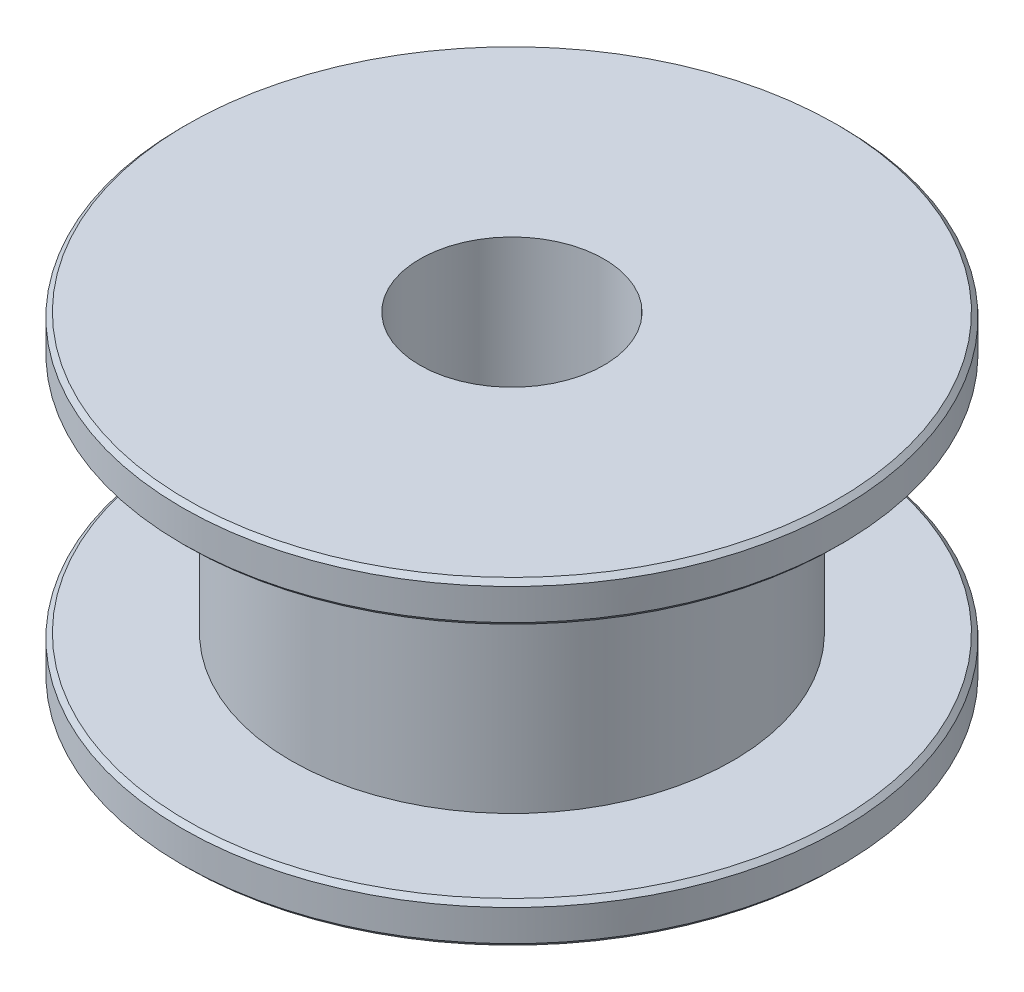
ISO-10303-21;
HEADER;
FILE_DESCRIPTION(('STEP AP214'),'2;1');
FILE_NAME('part.step','',(''),(''),'','','');
FILE_SCHEMA(('AUTOMOTIVE_DESIGN { 1 0 10303 214 1 1 1 1 }'));
ENDSEC;
DATA;
#1=APPLICATION_CONTEXT('core data for automotive mechanical design processes');
#2=APPLICATION_PROTOCOL_DEFINITION('international standard','automotive_design',2000,#1);
#3=PRODUCT_CONTEXT('',#1,'mechanical');
#4=PRODUCT('Part','Part','',(#3));
#5=PRODUCT_RELATED_PRODUCT_CATEGORY('part','',(#4));
#6=PRODUCT_DEFINITION_FORMATION('','',#4);
#7=PRODUCT_DEFINITION_CONTEXT('part definition',#1,'design');
#8=PRODUCT_DEFINITION('design','',#6,#7);
#9=PRODUCT_DEFINITION_SHAPE('','',#8);
#10=(LENGTH_UNIT() NAMED_UNIT(*) SI_UNIT(.MILLI.,.METRE.));
#11=(NAMED_UNIT(*) PLANE_ANGLE_UNIT() SI_UNIT($,.RADIAN.));
#12=(NAMED_UNIT(*) SI_UNIT($,.STERADIAN.) SOLID_ANGLE_UNIT());
#13=UNCERTAINTY_MEASURE_WITH_UNIT(LENGTH_MEASURE(1.E-05),#10,'distance_accuracy_value','');
#14=(GEOMETRIC_REPRESENTATION_CONTEXT(3) GLOBAL_UNCERTAINTY_ASSIGNED_CONTEXT((#13)) GLOBAL_UNIT_ASSIGNED_CONTEXT((#10,
#11,#12)) REPRESENTATION_CONTEXT('',''));
#15=CARTESIAN_POINT('',(0.,0.,0.));
#16=DIRECTION('',(0.,0.,1.));
#17=DIRECTION('',(1.,0.,0.));
#18=AXIS2_PLACEMENT_3D('',#15,#16,#17);
#19=CARTESIAN_POINT('',(8.95,4.325,0.));
#20=DIRECTION('',(0.,-1.,0.));
#21=DIRECTION('',(0.,0.,-1.));
#22=AXIS2_PLACEMENT_3D('',#19,#20,#21);
#23=PLANE('',#22);
#24=CARTESIAN_POINT('',(0.,4.325,0.));
#25=DIRECTION('',(0.,-1.,0.));
#26=DIRECTION('',(0.,0.,-1.));
#27=AXIS2_PLACEMENT_3D('',#24,#25,#26);
#28=CIRCLE('',#27,8.82499999999999);
#29=CARTESIAN_POINT('',(0.,4.325,-8.82499999999999));
#30=VERTEX_POINT('',#29);
#31=EDGE_CURVE('E10',#30,#30,#28,.F.);
#32=ORIENTED_EDGE('',*,*,#31,.T.);
#33=EDGE_LOOP('',(#32));
#34=FACE_BOUND('',#33,.T.);
#35=CARTESIAN_POINT('',(0.,4.325,0.));
#36=DIRECTION('',(0.,1.,0.));
#37=DIRECTION('',(0.,0.,1.));
#38=AXIS2_PLACEMENT_3D('',#35,#36,#37);
#39=CIRCLE('',#38,2.5);
#40=CARTESIAN_POINT('',(0.,4.325,2.5));
#41=VERTEX_POINT('',#40);
#42=EDGE_CURVE('E63',#41,#41,#39,.T.);
#43=ORIENTED_EDGE('',*,*,#42,.F.);
#44=EDGE_LOOP('',(#43));
#45=FACE_BOUND('',#44,.T.);
#46=ADVANCED_FACE('F31',(#34,#45),#23,.F.);
#47=CARTESIAN_POINT('',(0.,55.,0.));
#48=DIRECTION('',(0.,1.,0.));
#49=DIRECTION('',(0.,0.,1.));
#50=AXIS2_PLACEMENT_3D('',#47,#48,#49);
#51=CYLINDRICAL_SURFACE('',#50,2.5);
#52=CARTESIAN_POINT('',(0.,-4.325,0.));
#53=DIRECTION('',(0.,1.,0.));
#54=DIRECTION('',(0.,0.,1.));
#55=AXIS2_PLACEMENT_3D('',#52,#53,#54);
#56=CIRCLE('',#55,2.5);
#57=CARTESIAN_POINT('',(0.,-4.325,2.5));
#58=VERTEX_POINT('',#57);
#59=EDGE_CURVE('E66',#58,#58,#56,.T.);
#60=ORIENTED_EDGE('',*,*,#59,.F.);
#61=EDGE_LOOP('',(#60));
#62=FACE_BOUND('',#61,.T.);
#63=ORIENTED_EDGE('',*,*,#42,.T.);
#64=EDGE_LOOP('',(#63));
#65=FACE_BOUND('',#64,.T.);
#66=ADVANCED_FACE('F96',(#62,#65),#51,.F.);
#67=CARTESIAN_POINT('',(2.5,-4.325,0.));
#68=DIRECTION('',(0.,1.,0.));
#69=DIRECTION('',(0.,0.,1.));
#70=AXIS2_PLACEMENT_3D('',#67,#68,#69);
#71=PLANE('',#70);
#72=CARTESIAN_POINT('',(0.,-4.325,0.));
#73=DIRECTION('',(0.,1.,0.));
#74=DIRECTION('',(0.,0.,1.));
#75=AXIS2_PLACEMENT_3D('',#72,#73,#74);
#76=CIRCLE('',#75,8.825);
#77=CARTESIAN_POINT('',(0.,-4.325,8.825));
#78=VERTEX_POINT('',#77);
#79=EDGE_CURVE('E54',#78,#78,#76,.F.);
#80=ORIENTED_EDGE('',*,*,#79,.T.);
#81=EDGE_LOOP('',(#80));
#82=FACE_BOUND('',#81,.T.);
#83=ORIENTED_EDGE('',*,*,#59,.T.);
#84=EDGE_LOOP('',(#83));
#85=FACE_BOUND('',#84,.T.);
#86=ADVANCED_FACE('F92',(#82,#85),#71,.F.);
#87=CARTESIAN_POINT('',(0.,55.,0.));
#88=DIRECTION('',(0.,1.,0.));
#89=DIRECTION('',(0.,0.,1.));
#90=AXIS2_PLACEMENT_3D('',#87,#88,#89);
#91=CYLINDRICAL_SURFACE('',#90,8.95);
#92=CARTESIAN_POINT('',(0.,-4.20000000000001,0.));
#93=DIRECTION('',(0.,1.,0.));
#94=DIRECTION('',(0.,0.,1.));
#95=AXIS2_PLACEMENT_3D('',#92,#93,#94);
#96=CIRCLE('',#95,8.95);
#97=CARTESIAN_POINT('',(0.,-4.20000000000001,8.95));
#98=VERTEX_POINT('',#97);
#99=EDGE_CURVE('E57',#98,#98,#96,.T.);
#100=ORIENTED_EDGE('',*,*,#99,.T.);
#101=EDGE_LOOP('',(#100));
#102=FACE_BOUND('',#101,.T.);
#103=CARTESIAN_POINT('',(0.,-3.35000000000001,0.));
#104=DIRECTION('',(0.,-1.,0.));
#105=DIRECTION('',(0.,0.,-1.));
#106=AXIS2_PLACEMENT_3D('',#103,#104,#105);
#107=CIRCLE('',#106,8.95);
#108=CARTESIAN_POINT('',(0.,-3.35000000000001,-8.95));
#109=VERTEX_POINT('',#108);
#110=EDGE_CURVE('E60',#109,#109,#107,.T.);
#111=ORIENTED_EDGE('',*,*,#110,.T.);
#112=EDGE_LOOP('',(#111));
#113=FACE_BOUND('',#112,.T.);
#114=ADVANCED_FACE('F86',(#102,#113),#91,.T.);
#115=CARTESIAN_POINT('',(8.95,-3.225,0.));
#116=DIRECTION('',(0.,-1.,0.));
#117=DIRECTION('',(0.,0.,-1.));
#118=AXIS2_PLACEMENT_3D('',#115,#116,#117);
#119=PLANE('',#118);
#120=CARTESIAN_POINT('',(0.,-3.225,0.));
#121=DIRECTION('',(0.,-1.,0.));
#122=DIRECTION('',(0.,0.,-1.));
#123=AXIS2_PLACEMENT_3D('',#120,#121,#122);
#124=CIRCLE('',#123,8.82499999999999);
#125=CARTESIAN_POINT('',(0.,-3.225,-8.82499999999999));
#126=VERTEX_POINT('',#125);
#127=EDGE_CURVE('E51',#126,#126,#124,.F.);
#128=ORIENTED_EDGE('',*,*,#127,.T.);
#129=EDGE_LOOP('',(#128));
#130=FACE_BOUND('',#129,.T.);
#131=CARTESIAN_POINT('',(0.,-3.225,0.));
#132=DIRECTION('',(0.,1.,0.));
#133=DIRECTION('',(0.,0.,1.));
#134=AXIS2_PLACEMENT_3D('',#131,#132,#133);
#135=CIRCLE('',#134,6.);
#136=CARTESIAN_POINT('',(0.,-3.225,6.));
#137=VERTEX_POINT('',#136);
#138=EDGE_CURVE('E69',#137,#137,#135,.T.);
#139=ORIENTED_EDGE('',*,*,#138,.F.);
#140=EDGE_LOOP('',(#139));
#141=FACE_BOUND('',#140,.T.);
#142=ADVANCED_FACE('F81',(#130,#141),#119,.F.);
#143=CARTESIAN_POINT('',(0.,55.,0.));
#144=DIRECTION('',(0.,1.,0.));
#145=DIRECTION('',(0.,0.,1.));
#146=AXIS2_PLACEMENT_3D('',#143,#144,#145);
#147=CYLINDRICAL_SURFACE('',#146,6.);
#148=CARTESIAN_POINT('',(0.,3.225,0.));
#149=DIRECTION('',(0.,1.,0.));
#150=DIRECTION('',(0.,0.,1.));
#151=AXIS2_PLACEMENT_3D('',#148,#149,#150);
#152=CIRCLE('',#151,6.);
#153=CARTESIAN_POINT('',(0.,3.225,6.));
#154=VERTEX_POINT('',#153);
#155=EDGE_CURVE('E72',#154,#154,#152,.T.);
#156=ORIENTED_EDGE('',*,*,#155,.F.);
#157=EDGE_LOOP('',(#156));
#158=FACE_BOUND('',#157,.T.);
#159=ORIENTED_EDGE('',*,*,#138,.T.);
#160=EDGE_LOOP('',(#159));
#161=FACE_BOUND('',#160,.T.);
#162=ADVANCED_FACE('F78',(#158,#161),#147,.T.);
#163=CARTESIAN_POINT('',(6.,3.225,0.));
#164=DIRECTION('',(0.,1.,0.));
#165=DIRECTION('',(0.,0.,1.));
#166=AXIS2_PLACEMENT_3D('',#163,#164,#165);
#167=PLANE('',#166);
#168=CARTESIAN_POINT('',(0.,3.225,0.));
#169=DIRECTION('',(0.,1.,0.));
#170=DIRECTION('',(0.,0.,1.));
#171=AXIS2_PLACEMENT_3D('',#168,#169,#170);
#172=CIRCLE('',#171,8.825);
#173=CARTESIAN_POINT('',(0.,3.225,8.825));
#174=VERTEX_POINT('',#173);
#175=EDGE_CURVE('E38',#174,#174,#172,.F.);
#176=ORIENTED_EDGE('',*,*,#175,.T.);
#177=EDGE_LOOP('',(#176));
#178=FACE_BOUND('',#177,.T.);
#179=ORIENTED_EDGE('',*,*,#155,.T.);
#180=EDGE_LOOP('',(#179));
#181=FACE_BOUND('',#180,.T.);
#182=ADVANCED_FACE('F76',(#178,#181),#167,.F.);
#183=CARTESIAN_POINT('',(0.,55.,0.));
#184=DIRECTION('',(0.,1.,0.));
#185=DIRECTION('',(0.,0.,1.));
#186=AXIS2_PLACEMENT_3D('',#183,#184,#185);
#187=CYLINDRICAL_SURFACE('',#186,8.95);
#188=CARTESIAN_POINT('',(0.,3.35,0.));
#189=DIRECTION('',(0.,1.,0.));
#190=DIRECTION('',(0.,0.,1.));
#191=AXIS2_PLACEMENT_3D('',#188,#189,#190);
#192=CIRCLE('',#191,8.95);
#193=CARTESIAN_POINT('',(0.,3.35,8.95));
#194=VERTEX_POINT('',#193);
#195=EDGE_CURVE('E42',#194,#194,#192,.T.);
#196=ORIENTED_EDGE('',*,*,#195,.T.);
#197=EDGE_LOOP('',(#196));
#198=FACE_BOUND('',#197,.T.);
#199=CARTESIAN_POINT('',(0.,4.19999999999999,0.));
#200=DIRECTION('',(0.,-1.,0.));
#201=DIRECTION('',(0.,0.,-1.));
#202=AXIS2_PLACEMENT_3D('',#199,#200,#201);
#203=CIRCLE('',#202,8.95);
#204=CARTESIAN_POINT('',(0.,4.19999999999999,-8.95));
#205=VERTEX_POINT('',#204);
#206=EDGE_CURVE('E46',#205,#205,#203,.T.);
#207=ORIENTED_EDGE('',*,*,#206,.T.);
#208=EDGE_LOOP('',(#207));
#209=FACE_BOUND('',#208,.T.);
#210=ADVANCED_FACE('F110',(#198,#209),#187,.T.);
#211=CARTESIAN_POINT('',(0.,-4.20000000000001,0.));
#212=DIRECTION('',(0.,1.,0.));
#213=DIRECTION('',(0.,0.,1.));
#214=AXIS2_PLACEMENT_3D('',#211,#212,#213);
#215=CONICAL_SURFACE('',#214,8.95,0.785398163397469);
#216=ORIENTED_EDGE('',*,*,#79,.F.);
#217=EDGE_LOOP('',(#216));
#218=FACE_BOUND('',#217,.T.);
#219=ORIENTED_EDGE('',*,*,#99,.F.);
#220=EDGE_LOOP('',(#219));
#221=FACE_BOUND('',#220,.T.);
#222=ADVANCED_FACE('F106',(#218,#221),#215,.T.);
#223=CARTESIAN_POINT('',(0.,-3.225,0.));
#224=DIRECTION('',(0.,-1.,0.));
#225=DIRECTION('',(0.,0.,-1.));
#226=AXIS2_PLACEMENT_3D('',#223,#224,#225);
#227=CONICAL_SURFACE('',#226,8.82499999999999,0.785398163397435);
#228=ORIENTED_EDGE('',*,*,#110,.F.);
#229=EDGE_LOOP('',(#228));
#230=FACE_BOUND('',#229,.T.);
#231=ORIENTED_EDGE('',*,*,#127,.F.);
#232=EDGE_LOOP('',(#231));
#233=FACE_BOUND('',#232,.T.);
#234=ADVANCED_FACE('F109',(#230,#233),#227,.T.);
#235=CARTESIAN_POINT('',(0.,3.35,0.));
#236=DIRECTION('',(0.,1.,0.));
#237=DIRECTION('',(0.,0.,1.));
#238=AXIS2_PLACEMENT_3D('',#235,#236,#237);
#239=CONICAL_SURFACE('',#238,8.95,0.785398163397441);
#240=ORIENTED_EDGE('',*,*,#175,.F.);
#241=EDGE_LOOP('',(#240));
#242=FACE_BOUND('',#241,.T.);
#243=ORIENTED_EDGE('',*,*,#195,.F.);
#244=EDGE_LOOP('',(#243));
#245=FACE_BOUND('',#244,.T.);
#246=ADVANCED_FACE('F113',(#242,#245),#239,.T.);
#247=CARTESIAN_POINT('',(0.,4.325,0.));
#248=DIRECTION('',(0.,-1.,0.));
#249=DIRECTION('',(0.,0.,-1.));
#250=AXIS2_PLACEMENT_3D('',#247,#248,#249);
#251=CONICAL_SURFACE('',#250,8.82499999999999,0.785398163397448);
#252=ORIENTED_EDGE('',*,*,#206,.F.);
#253=EDGE_LOOP('',(#252));
#254=FACE_BOUND('',#253,.T.);
#255=ORIENTED_EDGE('',*,*,#31,.F.);
#256=EDGE_LOOP('',(#255));
#257=FACE_BOUND('',#256,.T.);
#258=ADVANCED_FACE('F33',(#254,#257),#251,.T.);
#259=CLOSED_SHELL('',(#46,#66,#86,#114,#142,#162,#182,#210,#222,#234,#246,#258));
#260=MANIFOLD_SOLID_BREP('B2',#259);
#261=ADVANCED_BREP_SHAPE_REPRESENTATION('',(#18,#260),#14);
#262=SHAPE_DEFINITION_REPRESENTATION(#9,#261);
ENDSEC;
END-ISO-10303-21;
